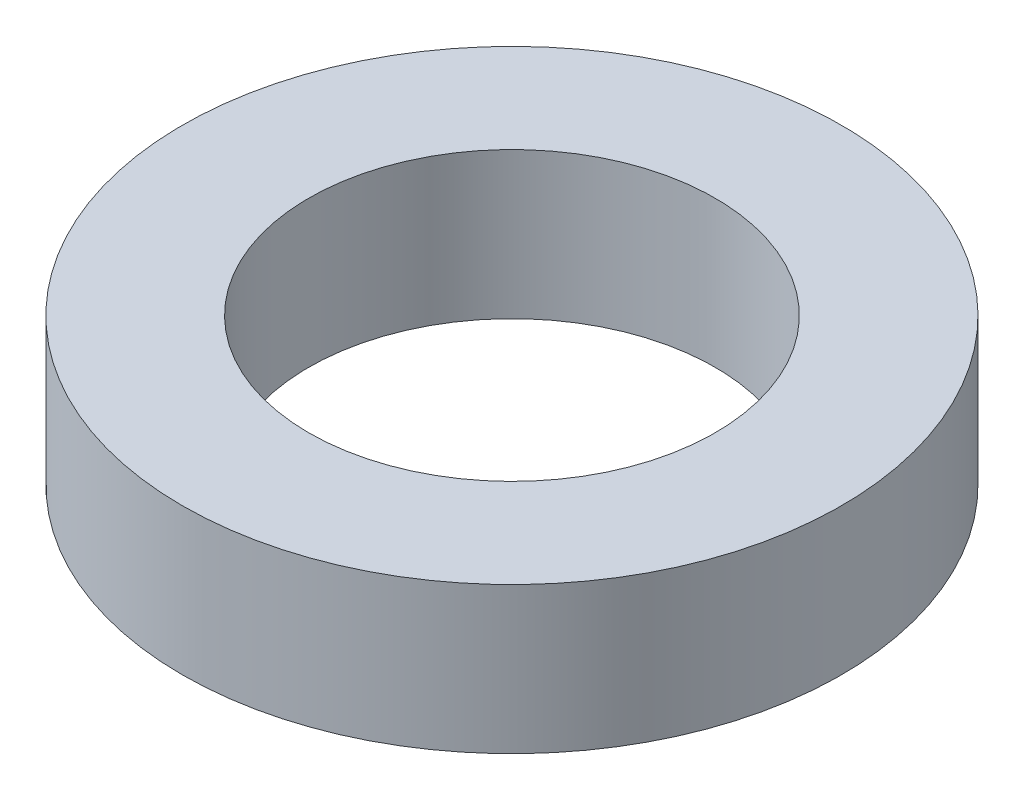
ISO-10303-21;
HEADER;
FILE_DESCRIPTION(('STEP AP214'),'2;1');
FILE_NAME('part.step','',(''),(''),'','','');
FILE_SCHEMA(('AUTOMOTIVE_DESIGN { 1 0 10303 214 1 1 1 1 }'));
ENDSEC;
DATA;
#1=APPLICATION_CONTEXT('core data for automotive mechanical design processes');
#2=APPLICATION_PROTOCOL_DEFINITION('international standard','automotive_design',2000,#1);
#3=PRODUCT_CONTEXT('',#1,'mechanical');
#4=PRODUCT('Part','Part','',(#3));
#5=PRODUCT_RELATED_PRODUCT_CATEGORY('part','',(#4));
#6=PRODUCT_DEFINITION_FORMATION('','',#4);
#7=PRODUCT_DEFINITION_CONTEXT('part definition',#1,'design');
#8=PRODUCT_DEFINITION('design','',#6,#7);
#9=PRODUCT_DEFINITION_SHAPE('','',#8);
#10=(LENGTH_UNIT() NAMED_UNIT(*) SI_UNIT(.MILLI.,.METRE.));
#11=(NAMED_UNIT(*) PLANE_ANGLE_UNIT() SI_UNIT($,.RADIAN.));
#12=(NAMED_UNIT(*) SI_UNIT($,.STERADIAN.) SOLID_ANGLE_UNIT());
#13=UNCERTAINTY_MEASURE_WITH_UNIT(LENGTH_MEASURE(1.E-05),#10,'distance_accuracy_value','');
#14=(GEOMETRIC_REPRESENTATION_CONTEXT(3) GLOBAL_UNCERTAINTY_ASSIGNED_CONTEXT((#13)) GLOBAL_UNIT_ASSIGNED_CONTEXT((#10,
#11,#12)) REPRESENTATION_CONTEXT('',''));
#15=CARTESIAN_POINT('',(0.,0.,0.));
#16=DIRECTION('',(0.,0.,1.));
#17=DIRECTION('',(1.,0.,0.));
#18=AXIS2_PLACEMENT_3D('',#15,#16,#17);
#19=CARTESIAN_POINT('',(0.,10.,0.));
#20=DIRECTION('',(0.,1.,0.));
#21=DIRECTION('',(0.,0.,1.));
#22=AXIS2_PLACEMENT_3D('',#19,#20,#21);
#23=PLANE('',#22);
#24=CARTESIAN_POINT('',(0.,10.,0.));
#25=DIRECTION('',(0.,1.,0.));
#26=DIRECTION('',(0.,0.,1.));
#27=AXIS2_PLACEMENT_3D('',#24,#25,#26);
#28=CIRCLE('',#27,22.5);
#29=CARTESIAN_POINT('',(0.,10.,22.5));
#30=VERTEX_POINT('',#29);
#31=EDGE_CURVE('E10',#30,#30,#28,.T.);
#32=ORIENTED_EDGE('',*,*,#31,.T.);
#33=EDGE_LOOP('',(#32));
#34=FACE_BOUND('',#33,.T.);
#35=CARTESIAN_POINT('',(0.,10.,0.));
#36=DIRECTION('',(0.,1.,0.));
#37=DIRECTION('',(0.,0.,1.));
#38=AXIS2_PLACEMENT_3D('',#35,#36,#37);
#39=CIRCLE('',#38,13.875);
#40=CARTESIAN_POINT('',(0.,10.,13.875));
#41=VERTEX_POINT('',#40);
#42=EDGE_CURVE('E52',#41,#41,#39,.T.);
#43=ORIENTED_EDGE('',*,*,#42,.F.);
#44=EDGE_LOOP('',(#43));
#45=FACE_BOUND('',#44,.T.);
#46=ADVANCED_FACE('F39',(#34,#45),#23,.T.);
#47=CARTESIAN_POINT('',(0.,0.,0.));
#48=DIRECTION('',(0.,1.,0.));
#49=DIRECTION('',(0.,0.,1.));
#50=AXIS2_PLACEMENT_3D('',#47,#48,#49);
#51=PLANE('',#50);
#52=CARTESIAN_POINT('',(0.,0.,0.));
#53=DIRECTION('',(0.,1.,0.));
#54=DIRECTION('',(0.,0.,1.));
#55=AXIS2_PLACEMENT_3D('',#52,#53,#54);
#56=CIRCLE('',#55,22.5);
#57=CARTESIAN_POINT('',(0.,0.,22.5));
#58=VERTEX_POINT('',#57);
#59=EDGE_CURVE('E43',#58,#58,#56,.T.);
#60=ORIENTED_EDGE('',*,*,#59,.F.);
#61=EDGE_LOOP('',(#60));
#62=FACE_BOUND('',#61,.T.);
#63=CARTESIAN_POINT('',(0.,0.,0.));
#64=DIRECTION('',(0.,1.,0.));
#65=DIRECTION('',(0.,0.,1.));
#66=AXIS2_PLACEMENT_3D('',#63,#64,#65);
#67=CIRCLE('',#66,13.875);
#68=CARTESIAN_POINT('',(0.,0.,13.875));
#69=VERTEX_POINT('',#68);
#70=EDGE_CURVE('E54',#69,#69,#67,.T.);
#71=ORIENTED_EDGE('',*,*,#70,.T.);
#72=EDGE_LOOP('',(#71));
#73=FACE_BOUND('',#72,.T.);
#74=ADVANCED_FACE('F66',(#62,#73),#51,.F.);
#75=CARTESIAN_POINT('',(0.,10.,0.));
#76=DIRECTION('',(0.,-1.,0.));
#77=DIRECTION('',(0.,0.,-1.));
#78=AXIS2_PLACEMENT_3D('',#75,#76,#77);
#79=CYLINDRICAL_SURFACE('',#78,22.5);
#80=ORIENTED_EDGE('',*,*,#31,.F.);
#81=EDGE_LOOP('',(#80));
#82=FACE_BOUND('',#81,.T.);
#83=ORIENTED_EDGE('',*,*,#59,.T.);
#84=EDGE_LOOP('',(#83));
#85=FACE_BOUND('',#84,.T.);
#86=ADVANCED_FACE('F41',(#82,#85),#79,.T.);
#87=CARTESIAN_POINT('',(0.,10.,0.));
#88=DIRECTION('',(0.,-1.,0.));
#89=DIRECTION('',(0.,0.,-1.));
#90=AXIS2_PLACEMENT_3D('',#87,#88,#89);
#91=CYLINDRICAL_SURFACE('',#90,13.875);
#92=ORIENTED_EDGE('',*,*,#42,.T.);
#93=EDGE_LOOP('',(#92));
#94=FACE_BOUND('',#93,.T.);
#95=ORIENTED_EDGE('',*,*,#70,.F.);
#96=EDGE_LOOP('',(#95));
#97=FACE_BOUND('',#96,.T.);
#98=ADVANCED_FACE('F62',(#94,#97),#91,.F.);
#99=CLOSED_SHELL('',(#46,#74,#86,#98));
#100=MANIFOLD_SOLID_BREP('B2',#99);
#101=ADVANCED_BREP_SHAPE_REPRESENTATION('',(#18,#100),#14);
#102=SHAPE_DEFINITION_REPRESENTATION(#9,#101);
ENDSEC;
END-ISO-10303-21;
